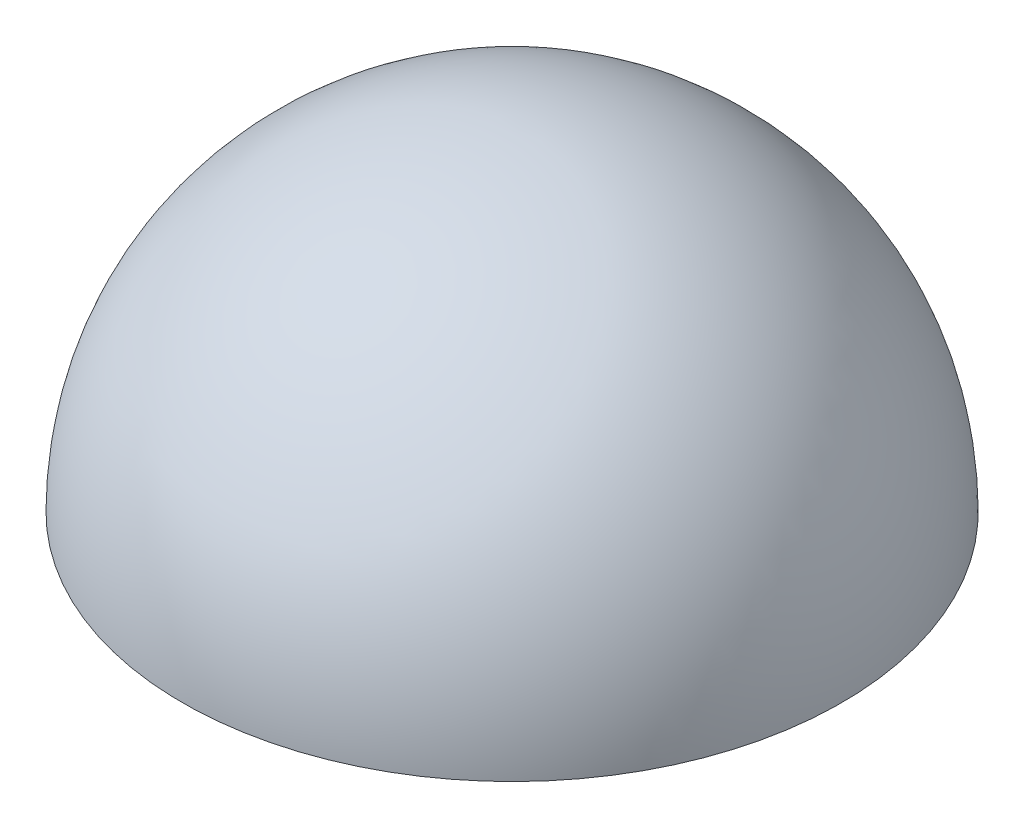
ISO-10303-21;
HEADER;
FILE_DESCRIPTION(('STEP AP214'),'2;1');
FILE_NAME('part.step','',(''),(''),'','','');
FILE_SCHEMA(('AUTOMOTIVE_DESIGN { 1 0 10303 214 1 1 1 1 }'));
ENDSEC;
DATA;
#1=APPLICATION_CONTEXT('core data for automotive mechanical design processes');
#2=APPLICATION_PROTOCOL_DEFINITION('international standard','automotive_design',2000,#1);
#3=PRODUCT_CONTEXT('',#1,'mechanical');
#4=PRODUCT('Part','Part','',(#3));
#5=PRODUCT_RELATED_PRODUCT_CATEGORY('part','',(#4));
#6=PRODUCT_DEFINITION_FORMATION('','',#4);
#7=PRODUCT_DEFINITION_CONTEXT('part definition',#1,'design');
#8=PRODUCT_DEFINITION('design','',#6,#7);
#9=PRODUCT_DEFINITION_SHAPE('','',#8);
#10=(LENGTH_UNIT() NAMED_UNIT(*) SI_UNIT(.MILLI.,.METRE.));
#11=(NAMED_UNIT(*) PLANE_ANGLE_UNIT() SI_UNIT($,.RADIAN.));
#12=(NAMED_UNIT(*) SI_UNIT($,.STERADIAN.) SOLID_ANGLE_UNIT());
#13=UNCERTAINTY_MEASURE_WITH_UNIT(LENGTH_MEASURE(1.E-05),#10,'distance_accuracy_value','');
#14=(GEOMETRIC_REPRESENTATION_CONTEXT(3) GLOBAL_UNCERTAINTY_ASSIGNED_CONTEXT((#13)) GLOBAL_UNIT_ASSIGNED_CONTEXT((#10,
#11,#12)) REPRESENTATION_CONTEXT('',''));
#15=CARTESIAN_POINT('',(0.,0.,0.));
#16=DIRECTION('',(0.,0.,1.));
#17=DIRECTION('',(1.,0.,0.));
#18=AXIS2_PLACEMENT_3D('',#15,#16,#17);
#19=CARTESIAN_POINT('',(0.,0.,0.));
#20=DIRECTION('',(-1.,0.,0.));
#21=DIRECTION('',(0.,0.,1.));
#22=AXIS2_PLACEMENT_3D('',#19,#20,#21);
#23=SPHERICAL_SURFACE('',#22,10.);
#24=CARTESIAN_POINT('',(0.,0.,0.));
#25=DIRECTION('',(0.,-1.,0.));
#26=DIRECTION('',(0.,0.,-1.));
#27=AXIS2_PLACEMENT_3D('',#24,#25,#26);
#28=SPHERICAL_SURFACE('',#27,10.);
#29=CARTESIAN_POINT('',(0.,0.,0.));
#30=DIRECTION('',(0.,-1.,0.));
#31=DIRECTION('',(0.,0.,-1.));
#32=AXIS2_PLACEMENT_3D('',#29,#30,#31);
#33=CIRCLE('',#32,10.);
#34=CARTESIAN_POINT('',(0.,0.,-10.));
#35=VERTEX_POINT('',#34);
#36=EDGE_CURVE('E10',#35,#35,#33,.T.);
#37=ORIENTED_EDGE('',*,*,#36,.F.);
#38=EDGE_LOOP('',(#37));
#39=FACE_BOUND('',#38,.T.);
#40=ADVANCED_FACE('F37',(#39),#28,.T.);
#41=CARTESIAN_POINT('',(0.,0.,0.));
#42=DIRECTION('',(0.,-1.,0.));
#43=DIRECTION('',(0.,0.,-1.));
#44=AXIS2_PLACEMENT_3D('',#41,#42,#43);
#45=PLANE('',#44);
#46=ORIENTED_EDGE('',*,*,#36,.T.);
#47=EDGE_LOOP('',(#46));
#48=FACE_BOUND('',#47,.T.);
#49=ADVANCED_FACE('F45',(#48),#45,.T.);
#50=CLOSED_SHELL('',(#40,#49));
#51=MANIFOLD_SOLID_BREP('B2',#50);
#52=ADVANCED_BREP_SHAPE_REPRESENTATION('',(#18,#51),#14);
#53=SHAPE_DEFINITION_REPRESENTATION(#9,#52);
ENDSEC;
END-ISO-10303-21;
